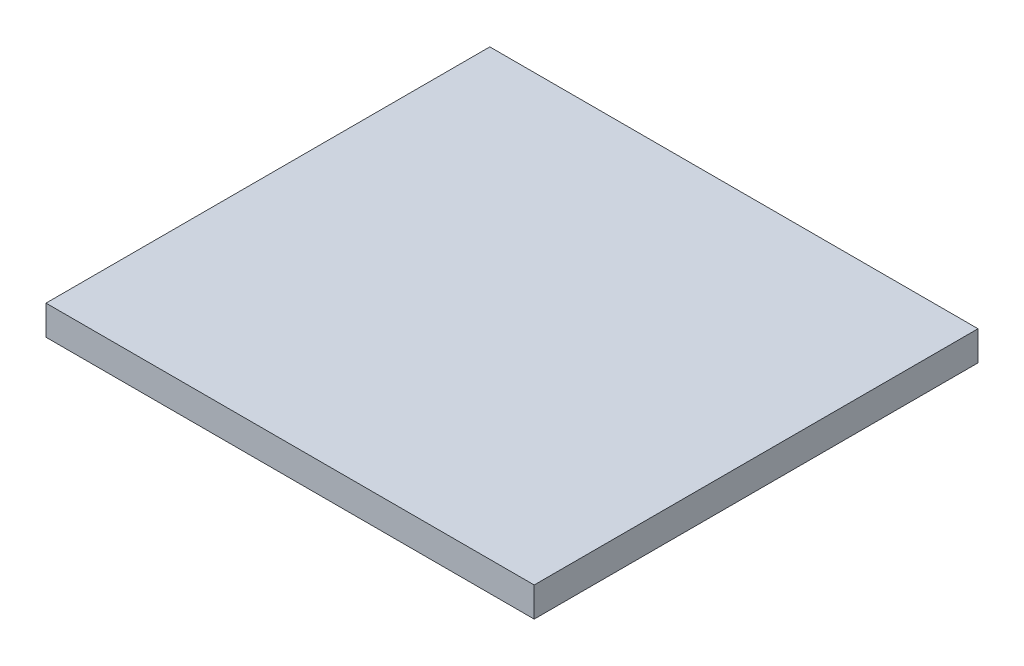
ISO-10303-21;
HEADER;
FILE_DESCRIPTION(('STEP AP214'),'2;1');
FILE_NAME('part.step','',(''),(''),'','','');
FILE_SCHEMA(('AUTOMOTIVE_DESIGN { 1 0 10303 214 1 1 1 1 }'));
ENDSEC;
DATA;
#1=APPLICATION_CONTEXT('core data for automotive mechanical design processes');
#2=APPLICATION_PROTOCOL_DEFINITION('international standard','automotive_design',2000,#1);
#3=PRODUCT_CONTEXT('',#1,'mechanical');
#4=PRODUCT('Part','Part','',(#3));
#5=PRODUCT_RELATED_PRODUCT_CATEGORY('part','',(#4));
#6=PRODUCT_DEFINITION_FORMATION('','',#4);
#7=PRODUCT_DEFINITION_CONTEXT('part definition',#1,'design');
#8=PRODUCT_DEFINITION('design','',#6,#7);
#9=PRODUCT_DEFINITION_SHAPE('','',#8);
#10=(LENGTH_UNIT() NAMED_UNIT(*) SI_UNIT(.MILLI.,.METRE.));
#11=(NAMED_UNIT(*) PLANE_ANGLE_UNIT() SI_UNIT($,.RADIAN.));
#12=(NAMED_UNIT(*) SI_UNIT($,.STERADIAN.) SOLID_ANGLE_UNIT());
#13=UNCERTAINTY_MEASURE_WITH_UNIT(LENGTH_MEASURE(1.E-05),#10,'distance_accuracy_value','');
#14=(GEOMETRIC_REPRESENTATION_CONTEXT(3) GLOBAL_UNCERTAINTY_ASSIGNED_CONTEXT((#13)) GLOBAL_UNIT_ASSIGNED_CONTEXT((#10,
#11,#12)) REPRESENTATION_CONTEXT('',''));
#15=CARTESIAN_POINT('',(0.,0.,0.));
#16=DIRECTION('',(0.,0.,1.));
#17=DIRECTION('',(1.,0.,0.));
#18=AXIS2_PLACEMENT_3D('',#15,#16,#17);
#19=CARTESIAN_POINT('',(82.5,5.,75.));
#20=DIRECTION('',(-1.,0.,0.));
#21=DIRECTION('',(0.,0.,1.));
#22=AXIS2_PLACEMENT_3D('',#19,#20,#21);
#23=PLANE('',#22);
#24=DIRECTION('',(0.,0.,-1.));
#25=VECTOR('',#24,1.);
#26=CARTESIAN_POINT('',(82.5,-5.,75.));
#27=LINE('',#26,#25);
#28=CARTESIAN_POINT('',(82.5,-5.,75.));
#29=VERTEX_POINT('',#28);
#30=CARTESIAN_POINT('',(82.5,-5.,-75.));
#31=VERTEX_POINT('',#30);
#32=EDGE_CURVE('E95',#29,#31,#27,.T.);
#33=ORIENTED_EDGE('',*,*,#32,.T.);
#34=DIRECTION('',(0.,-1.,0.));
#35=VECTOR('',#34,1.);
#36=CARTESIAN_POINT('',(82.5,5.,-75.));
#37=LINE('',#36,#35);
#38=CARTESIAN_POINT('',(82.5,5.,-75.));
#39=VERTEX_POINT('',#38);
#40=EDGE_CURVE('E11',#39,#31,#37,.T.);
#41=ORIENTED_EDGE('',*,*,#40,.F.);
#42=DIRECTION('',(0.,0.,-1.));
#43=VECTOR('',#42,1.);
#44=CARTESIAN_POINT('',(82.5,5.,75.));
#45=LINE('',#44,#43);
#46=CARTESIAN_POINT('',(82.5,5.,75.));
#47=VERTEX_POINT('',#46);
#48=EDGE_CURVE('E83',#47,#39,#45,.T.);
#49=ORIENTED_EDGE('',*,*,#48,.F.);
#50=DIRECTION('',(0.,-1.,0.));
#51=VECTOR('',#50,1.);
#52=CARTESIAN_POINT('',(82.5,5.,75.));
#53=LINE('',#52,#51);
#54=EDGE_CURVE('E91',#47,#29,#53,.T.);
#55=ORIENTED_EDGE('',*,*,#54,.T.);
#56=EDGE_LOOP('',(#33,#41,#49,#55));
#57=FACE_BOUND('',#56,.T.);
#58=ADVANCED_FACE('F32',(#57),#23,.F.);
#59=CARTESIAN_POINT('',(-82.5,5.,-75.));
#60=DIRECTION('',(0.,0.,1.));
#61=DIRECTION('',(1.,0.,0.));
#62=AXIS2_PLACEMENT_3D('',#59,#60,#61);
#63=PLANE('',#62);
#64=DIRECTION('',(-1.,0.,0.));
#65=VECTOR('',#64,1.);
#66=CARTESIAN_POINT('',(-82.5,-5.,-75.));
#67=LINE('',#66,#65);
#68=CARTESIAN_POINT('',(-82.5,-5.,-75.));
#69=VERTEX_POINT('',#68);
#70=EDGE_CURVE('E87',#31,#69,#67,.T.);
#71=ORIENTED_EDGE('',*,*,#70,.T.);
#72=DIRECTION('',(0.,-1.,0.));
#73=VECTOR('',#72,1.);
#74=CARTESIAN_POINT('',(-82.5,5.,-75.));
#75=LINE('',#74,#73);
#76=CARTESIAN_POINT('',(-82.5,5.,-75.));
#77=VERTEX_POINT('',#76);
#78=EDGE_CURVE('E40',#77,#69,#75,.T.);
#79=ORIENTED_EDGE('',*,*,#78,.F.);
#80=DIRECTION('',(-1.,0.,0.));
#81=VECTOR('',#80,1.);
#82=CARTESIAN_POINT('',(-82.5,5.,-75.));
#83=LINE('',#82,#81);
#84=EDGE_CURVE('E78',#39,#77,#83,.T.);
#85=ORIENTED_EDGE('',*,*,#84,.F.);
#86=ORIENTED_EDGE('',*,*,#40,.T.);
#87=EDGE_LOOP('',(#71,#79,#85,#86));
#88=FACE_BOUND('',#87,.T.);
#89=ADVANCED_FACE('F86',(#88),#63,.F.);
#90=CARTESIAN_POINT('',(-82.5,5.,75.));
#91=DIRECTION('',(1.,0.,0.));
#92=DIRECTION('',(0.,0.,-1.));
#93=AXIS2_PLACEMENT_3D('',#90,#91,#92);
#94=PLANE('',#93);
#95=DIRECTION('',(0.,0.,1.));
#96=VECTOR('',#95,1.);
#97=CARTESIAN_POINT('',(-82.5,-5.,75.));
#98=LINE('',#97,#96);
#99=CARTESIAN_POINT('',(-82.5,-5.,75.));
#100=VERTEX_POINT('',#99);
#101=EDGE_CURVE('E65',#69,#100,#98,.T.);
#102=ORIENTED_EDGE('',*,*,#101,.T.);
#103=DIRECTION('',(0.,-1.,0.));
#104=VECTOR('',#103,1.);
#105=CARTESIAN_POINT('',(-82.5,5.,75.));
#106=LINE('',#105,#104);
#107=CARTESIAN_POINT('',(-82.5,5.,75.));
#108=VERTEX_POINT('',#107);
#109=EDGE_CURVE('E88',#108,#100,#106,.T.);
#110=ORIENTED_EDGE('',*,*,#109,.F.);
#111=DIRECTION('',(0.,0.,1.));
#112=VECTOR('',#111,1.);
#113=CARTESIAN_POINT('',(-82.5,5.,75.));
#114=LINE('',#113,#112);
#115=EDGE_CURVE('E81',#77,#108,#114,.T.);
#116=ORIENTED_EDGE('',*,*,#115,.F.);
#117=ORIENTED_EDGE('',*,*,#78,.T.);
#118=EDGE_LOOP('',(#102,#110,#116,#117));
#119=FACE_BOUND('',#118,.T.);
#120=ADVANCED_FACE('F89',(#119),#94,.F.);
#121=CARTESIAN_POINT('',(-82.5,5.,75.));
#122=DIRECTION('',(0.,0.,-1.));
#123=DIRECTION('',(-1.,0.,0.));
#124=AXIS2_PLACEMENT_3D('',#121,#122,#123);
#125=PLANE('',#124);
#126=DIRECTION('',(1.,0.,0.));
#127=VECTOR('',#126,1.);
#128=CARTESIAN_POINT('',(-82.5,-5.,75.));
#129=LINE('',#128,#127);
#130=EDGE_CURVE('E71',#100,#29,#129,.T.);
#131=ORIENTED_EDGE('',*,*,#130,.T.);
#132=ORIENTED_EDGE('',*,*,#54,.F.);
#133=DIRECTION('',(1.,0.,0.));
#134=VECTOR('',#133,1.);
#135=CARTESIAN_POINT('',(-82.5,5.,75.));
#136=LINE('',#135,#134);
#137=EDGE_CURVE('E48',#108,#47,#136,.T.);
#138=ORIENTED_EDGE('',*,*,#137,.F.);
#139=ORIENTED_EDGE('',*,*,#109,.T.);
#140=EDGE_LOOP('',(#131,#132,#138,#139));
#141=FACE_BOUND('',#140,.T.);
#142=ADVANCED_FACE('F102',(#141),#125,.F.);
#143=CARTESIAN_POINT('',(0.,5.,0.));
#144=DIRECTION('',(0.,-1.,0.));
#145=DIRECTION('',(0.,0.,-1.));
#146=AXIS2_PLACEMENT_3D('',#143,#144,#145);
#147=PLANE('',#146);
#148=ORIENTED_EDGE('',*,*,#48,.T.);
#149=ORIENTED_EDGE('',*,*,#84,.T.);
#150=ORIENTED_EDGE('',*,*,#115,.T.);
#151=ORIENTED_EDGE('',*,*,#137,.T.);
#152=EDGE_LOOP('',(#148,#149,#150,#151));
#153=FACE_BOUND('',#152,.T.);
#154=ADVANCED_FACE('F79',(#153),#147,.F.);
#155=CARTESIAN_POINT('',(0.,-5.,0.));
#156=DIRECTION('',(0.,-1.,0.));
#157=DIRECTION('',(0.,0.,-1.));
#158=AXIS2_PLACEMENT_3D('',#155,#156,#157);
#159=PLANE('',#158);
#160=ORIENTED_EDGE('',*,*,#32,.F.);
#161=ORIENTED_EDGE('',*,*,#130,.F.);
#162=ORIENTED_EDGE('',*,*,#101,.F.);
#163=ORIENTED_EDGE('',*,*,#70,.F.);
#164=EDGE_LOOP('',(#160,#161,#162,#163));
#165=FACE_BOUND('',#164,.T.);
#166=ADVANCED_FACE('F105',(#165),#159,.T.);
#167=CLOSED_SHELL('',(#58,#89,#120,#142,#154,#166));
#168=MANIFOLD_SOLID_BREP('B2',#167);
#169=ADVANCED_BREP_SHAPE_REPRESENTATION('',(#18,#168),#14);
#170=SHAPE_DEFINITION_REPRESENTATION(#9,#169);
ENDSEC;
END-ISO-10303-21;
